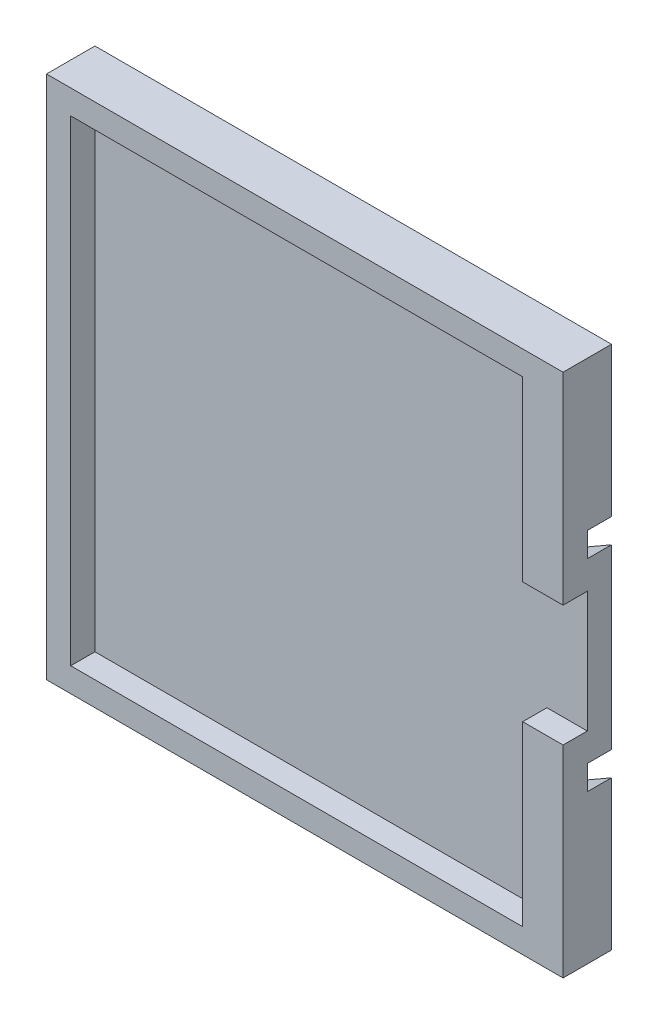
ISO-10303-21;
HEADER;
FILE_DESCRIPTION(('STEP AP214'),'2;1');
FILE_NAME('part.step','',(''),(''),'','','');
FILE_SCHEMA(('AUTOMOTIVE_DESIGN { 1 0 10303 214 1 1 1 1 }'));
ENDSEC;
DATA;
#1=APPLICATION_CONTEXT('core data for automotive mechanical design processes');
#2=APPLICATION_PROTOCOL_DEFINITION('international standard','automotive_design',2000,#1);
#3=PRODUCT_CONTEXT('',#1,'mechanical');
#4=PRODUCT('Part','Part','',(#3));
#5=PRODUCT_RELATED_PRODUCT_CATEGORY('part','',(#4));
#6=PRODUCT_DEFINITION_FORMATION('','',#4);
#7=PRODUCT_DEFINITION_CONTEXT('part definition',#1,'design');
#8=PRODUCT_DEFINITION('design','',#6,#7);
#9=PRODUCT_DEFINITION_SHAPE('','',#8);
#10=(LENGTH_UNIT() NAMED_UNIT(*) SI_UNIT(.MILLI.,.METRE.));
#11=(NAMED_UNIT(*) PLANE_ANGLE_UNIT() SI_UNIT($,.RADIAN.));
#12=(NAMED_UNIT(*) SI_UNIT($,.STERADIAN.) SOLID_ANGLE_UNIT());
#13=UNCERTAINTY_MEASURE_WITH_UNIT(LENGTH_MEASURE(1.E-05),#10,'distance_accuracy_value','');
#14=(GEOMETRIC_REPRESENTATION_CONTEXT(3) GLOBAL_UNCERTAINTY_ASSIGNED_CONTEXT((#13)) GLOBAL_UNIT_ASSIGNED_CONTEXT((#10,
#11,#12)) REPRESENTATION_CONTEXT('',''));
#15=CARTESIAN_POINT('',(0.,0.,0.));
#16=DIRECTION('',(0.,0.,1.));
#17=DIRECTION('',(1.,0.,0.));
#18=AXIS2_PLACEMENT_3D('',#15,#16,#17);
#19=CARTESIAN_POINT('',(6.48577771688617,-11.2336965322449,6.));
#20=DIRECTION('',(0.500000000000001,-0.866025403784438,0.));
#21=DIRECTION('',(0.866025403784438,0.500000000000001,0.));
#22=AXIS2_PLACEMENT_3D('',#19,#20,#21);
#23=PLANE('',#22);
#24=DIRECTION('',(-0.866025403784438,-0.5,0.));
#25=VECTOR('',#24,1.);
#26=CARTESIAN_POINT('',(6.48577771688617,-11.2336965322449,0.));
#27=LINE('',#26,#25);
#28=CARTESIAN_POINT('',(64.,21.9721551851429,0.));
#29=VERTEX_POINT('',#28);
#30=CARTESIAN_POINT('',(55.8729999999999,17.2800295474387,0.));
#31=VERTEX_POINT('',#30);
#32=EDGE_CURVE('E266',#29,#31,#27,.T.);
#33=ORIENTED_EDGE('',*,*,#32,.T.);
#34=DIRECTION('',(0.,0.,-1.));
#35=VECTOR('',#34,1.);
#36=CARTESIAN_POINT('',(55.8729999999999,17.2800295474387,6.));
#37=LINE('',#36,#35);
#38=CARTESIAN_POINT('',(55.8729999999999,17.2800295474387,6.));
#39=VERTEX_POINT('',#38);
#40=EDGE_CURVE('E11',#39,#31,#37,.T.);
#41=ORIENTED_EDGE('',*,*,#40,.F.);
#42=DIRECTION('',(-0.866025403784438,-0.5,0.));
#43=VECTOR('',#42,1.);
#44=CARTESIAN_POINT('',(6.48577771688617,-11.2336965322449,6.));
#45=LINE('',#44,#43);
#46=CARTESIAN_POINT('',(64.,21.9721551851429,6.));
#47=VERTEX_POINT('',#46);
#48=EDGE_CURVE('E267',#47,#39,#45,.T.);
#49=ORIENTED_EDGE('',*,*,#48,.F.);
#50=DIRECTION('',(0.,0.,-1.));
#51=VECTOR('',#50,1.);
#52=CARTESIAN_POINT('',(64.,21.9721551851429,6.));
#53=LINE('',#52,#51);
#54=EDGE_CURVE('E289',#47,#29,#53,.T.);
#55=ORIENTED_EDGE('',*,*,#54,.T.);
#56=EDGE_LOOP('',(#33,#41,#49,#55));
#57=FACE_BOUND('',#56,.T.);
#58=ADVANCED_FACE('F41',(#57),#23,.F.);
#59=CARTESIAN_POINT('',(55.8729999999999,0.,6.));
#60=DIRECTION('',(-1.,0.,0.));
#61=DIRECTION('',(0.,-1.,0.));
#62=AXIS2_PLACEMENT_3D('',#59,#60,#61);
#63=PLANE('',#62);
#64=DIRECTION('',(0.,1.,0.));
#65=VECTOR('',#64,1.);
#66=CARTESIAN_POINT('',(55.8729999999999,0.,0.));
#67=LINE('',#66,#65);
#68=CARTESIAN_POINT('',(55.8729999999999,32.7199704525613,0.));
#69=VERTEX_POINT('',#68);
#70=EDGE_CURVE('E292',#31,#69,#67,.T.);
#71=ORIENTED_EDGE('',*,*,#70,.T.);
#72=DIRECTION('',(0.,0.,-1.));
#73=VECTOR('',#72,1.);
#74=CARTESIAN_POINT('',(55.8729999999999,32.7199704525613,6.));
#75=LINE('',#74,#73);
#76=CARTESIAN_POINT('',(55.8729999999999,32.7199704525613,6.));
#77=VERTEX_POINT('',#76);
#78=EDGE_CURVE('E48',#77,#69,#75,.T.);
#79=ORIENTED_EDGE('',*,*,#78,.F.);
#80=DIRECTION('',(0.,1.,0.));
#81=VECTOR('',#80,1.);
#82=CARTESIAN_POINT('',(55.8729999999999,0.,6.));
#83=LINE('',#82,#81);
#84=EDGE_CURVE('E270',#39,#77,#83,.T.);
#85=ORIENTED_EDGE('',*,*,#84,.F.);
#86=ORIENTED_EDGE('',*,*,#40,.T.);
#87=EDGE_LOOP('',(#71,#79,#85,#86));
#88=FACE_BOUND('',#87,.T.);
#89=ADVANCED_FACE('F354',(#88),#63,.F.);
#90=CARTESIAN_POINT('',(28.1364128114971,48.7336965322449,6.));
#91=DIRECTION('',(0.5,0.866025403784439,0.));
#92=DIRECTION('',(-0.866025403784439,0.5,0.));
#93=AXIS2_PLACEMENT_3D('',#90,#91,#92);
#94=PLANE('',#93);
#95=DIRECTION('',(0.866025403784439,-0.5,0.));
#96=VECTOR('',#95,1.);
#97=CARTESIAN_POINT('',(28.1364128114971,48.7336965322449,0.));
#98=LINE('',#97,#96);
#99=CARTESIAN_POINT('',(64.,28.0278448148571,0.));
#100=VERTEX_POINT('',#99);
#101=EDGE_CURVE('E294',#69,#100,#98,.T.);
#102=ORIENTED_EDGE('',*,*,#101,.T.);
#103=DIRECTION('',(0.,0.,-1.));
#104=VECTOR('',#103,1.);
#105=CARTESIAN_POINT('',(64.,28.0278448148571,6.));
#106=LINE('',#105,#104);
#107=CARTESIAN_POINT('',(64.,28.0278448148571,6.));
#108=VERTEX_POINT('',#107);
#109=EDGE_CURVE('E332',#108,#100,#106,.T.);
#110=ORIENTED_EDGE('',*,*,#109,.F.);
#111=DIRECTION('',(0.866025403784439,-0.5,0.));
#112=VECTOR('',#111,1.);
#113=CARTESIAN_POINT('',(28.1364128114971,48.7336965322449,6.));
#114=LINE('',#113,#112);
#115=EDGE_CURVE('E274',#77,#108,#114,.T.);
#116=ORIENTED_EDGE('',*,*,#115,.F.);
#117=ORIENTED_EDGE('',*,*,#78,.T.);
#118=EDGE_LOOP('',(#102,#110,#116,#117));
#119=FACE_BOUND('',#118,.T.);
#120=ADVANCED_FACE('F338',(#119),#94,.F.);
#121=CARTESIAN_POINT('',(0.,65.,6.));
#122=DIRECTION('',(0.,1.,0.));
#123=DIRECTION('',(-1.,0.,0.));
#124=AXIS2_PLACEMENT_3D('',#121,#122,#123);
#125=PLANE('',#124);
#126=DIRECTION('',(1.,0.,0.));
#127=VECTOR('',#126,1.);
#128=CARTESIAN_POINT('',(0.,65.,0.));
#129=LINE('',#128,#127);
#130=CARTESIAN_POINT('',(-64.,65.,0.));
#131=VERTEX_POINT('',#130);
#132=CARTESIAN_POINT('',(64.,65.,0.));
#133=VERTEX_POINT('',#132);
#134=EDGE_CURVE('E299',#131,#133,#129,.T.);
#135=ORIENTED_EDGE('',*,*,#134,.F.);
#136=DIRECTION('',(0.,0.,-1.));
#137=VECTOR('',#136,1.);
#138=CARTESIAN_POINT('',(-64.,65.,6.));
#139=LINE('',#138,#137);
#140=CARTESIAN_POINT('',(-64.,65.,12.));
#141=VERTEX_POINT('',#140);
#142=EDGE_CURVE('E184',#141,#131,#139,.T.);
#143=ORIENTED_EDGE('',*,*,#142,.F.);
#144=DIRECTION('',(-1.,0.,0.));
#145=VECTOR('',#144,1.);
#146=CARTESIAN_POINT('',(-64.,65.,12.));
#147=LINE('',#146,#145);
#148=CARTESIAN_POINT('',(64.,65.,12.));
#149=VERTEX_POINT('',#148);
#150=EDGE_CURVE('E199',#149,#141,#147,.T.);
#151=ORIENTED_EDGE('',*,*,#150,.F.);
#152=DIRECTION('',(0.,0.,-1.));
#153=VECTOR('',#152,1.);
#154=CARTESIAN_POINT('',(64.,65.,6.));
#155=LINE('',#154,#153);
#156=EDGE_CURVE('E330',#149,#133,#155,.T.);
#157=ORIENTED_EDGE('',*,*,#156,.T.);
#158=EDGE_LOOP('',(#135,#143,#151,#157));
#159=FACE_BOUND('',#158,.T.);
#160=ADVANCED_FACE('F417',(#159),#125,.T.);
#161=CARTESIAN_POINT('',(-64.,0.,6.));
#162=DIRECTION('',(-1.,0.,0.));
#163=DIRECTION('',(0.,0.,1.));
#164=AXIS2_PLACEMENT_3D('',#161,#162,#163);
#165=PLANE('',#164);
#166=DIRECTION('',(0.,1.,0.));
#167=VECTOR('',#166,1.);
#168=CARTESIAN_POINT('',(-64.,0.,0.));
#169=LINE('',#168,#167);
#170=CARTESIAN_POINT('',(-64.,-65.,0.));
#171=VERTEX_POINT('',#170);
#172=EDGE_CURVE('E181',#171,#131,#169,.T.);
#173=ORIENTED_EDGE('',*,*,#172,.F.);
#174=DIRECTION('',(0.,0.,-1.));
#175=VECTOR('',#174,1.);
#176=CARTESIAN_POINT('',(-64.,-65.,6.));
#177=LINE('',#176,#175);
#178=CARTESIAN_POINT('',(-64.,-65.,12.));
#179=VERTEX_POINT('',#178);
#180=EDGE_CURVE('E175',#179,#171,#177,.T.);
#181=ORIENTED_EDGE('',*,*,#180,.F.);
#182=DIRECTION('',(0.,-1.,0.));
#183=VECTOR('',#182,1.);
#184=CARTESIAN_POINT('',(-64.,65.,12.));
#185=LINE('',#184,#183);
#186=EDGE_CURVE('E179',#141,#179,#185,.T.);
#187=ORIENTED_EDGE('',*,*,#186,.F.);
#188=ORIENTED_EDGE('',*,*,#142,.T.);
#189=EDGE_LOOP('',(#173,#181,#187,#188));
#190=FACE_BOUND('',#189,.T.);
#191=ADVANCED_FACE('F177',(#190),#165,.T.);
#192=CARTESIAN_POINT('',(0.,-65.,6.));
#193=DIRECTION('',(0.,1.,0.));
#194=DIRECTION('',(0.,0.,1.));
#195=AXIS2_PLACEMENT_3D('',#192,#193,#194);
#196=PLANE('',#195);
#197=DIRECTION('',(1.,0.,0.));
#198=VECTOR('',#197,1.);
#199=CARTESIAN_POINT('',(0.,-65.,0.));
#200=LINE('',#199,#198);
#201=CARTESIAN_POINT('',(64.,-65.,0.));
#202=VERTEX_POINT('',#201);
#203=EDGE_CURVE('E303',#171,#202,#200,.T.);
#204=ORIENTED_EDGE('',*,*,#203,.T.);
#205=DIRECTION('',(0.,0.,-1.));
#206=VECTOR('',#205,1.);
#207=CARTESIAN_POINT('',(64.,-65.,6.));
#208=LINE('',#207,#206);
#209=CARTESIAN_POINT('',(64.,-65.,12.));
#210=VERTEX_POINT('',#209);
#211=EDGE_CURVE('E185',#210,#202,#208,.T.);
#212=ORIENTED_EDGE('',*,*,#211,.F.);
#213=DIRECTION('',(1.,0.,0.));
#214=VECTOR('',#213,1.);
#215=CARTESIAN_POINT('',(-64.,-65.,12.));
#216=LINE('',#215,#214);
#217=EDGE_CURVE('E188',#179,#210,#216,.T.);
#218=ORIENTED_EDGE('',*,*,#217,.F.);
#219=ORIENTED_EDGE('',*,*,#180,.T.);
#220=EDGE_LOOP('',(#204,#212,#218,#219));
#221=FACE_BOUND('',#220,.T.);
#222=ADVANCED_FACE('F189',(#221),#196,.F.);
#223=CARTESIAN_POINT('',(28.136412811497,-48.7336965322449,6.));
#224=DIRECTION('',(-0.499999999999999,0.866025403784439,0.));
#225=DIRECTION('',(-0.866025403784439,-0.499999999999999,0.));
#226=AXIS2_PLACEMENT_3D('',#223,#224,#225);
#227=PLANE('',#226);
#228=DIRECTION('',(0.866025403784439,0.499999999999999,0.));
#229=VECTOR('',#228,1.);
#230=CARTESIAN_POINT('',(28.136412811497,-48.7336965322449,0.));
#231=LINE('',#230,#229);
#232=CARTESIAN_POINT('',(55.8729999999999,-32.7199704525612,0.));
#233=VERTEX_POINT('',#232);
#234=CARTESIAN_POINT('',(64.,-28.0278448148571,0.));
#235=VERTEX_POINT('',#234);
#236=EDGE_CURVE('E308',#233,#235,#231,.T.);
#237=ORIENTED_EDGE('',*,*,#236,.F.);
#238=DIRECTION('',(0.,0.,-1.));
#239=VECTOR('',#238,1.);
#240=CARTESIAN_POINT('',(55.8729999999999,-32.7199704525612,6.));
#241=LINE('',#240,#239);
#242=CARTESIAN_POINT('',(55.8729999999999,-32.7199704525612,6.));
#243=VERTEX_POINT('',#242);
#244=EDGE_CURVE('E324',#243,#233,#241,.T.);
#245=ORIENTED_EDGE('',*,*,#244,.F.);
#246=DIRECTION('',(0.866025403784439,0.499999999999999,0.));
#247=VECTOR('',#246,1.);
#248=CARTESIAN_POINT('',(28.136412811497,-48.7336965322449,6.));
#249=LINE('',#248,#247);
#250=CARTESIAN_POINT('',(64.,-28.0278448148571,6.));
#251=VERTEX_POINT('',#250);
#252=EDGE_CURVE('E277',#243,#251,#249,.T.);
#253=ORIENTED_EDGE('',*,*,#252,.T.);
#254=DIRECTION('',(0.,0.,-1.));
#255=VECTOR('',#254,1.);
#256=CARTESIAN_POINT('',(64.,-28.0278448148571,6.));
#257=LINE('',#256,#255);
#258=EDGE_CURVE('E326',#251,#235,#257,.T.);
#259=ORIENTED_EDGE('',*,*,#258,.T.);
#260=EDGE_LOOP('',(#237,#245,#253,#259));
#261=FACE_BOUND('',#260,.T.);
#262=ADVANCED_FACE('F369',(#261),#227,.T.);
#263=CARTESIAN_POINT('',(55.8729999999999,0.,6.));
#264=DIRECTION('',(1.,0.,0.));
#265=DIRECTION('',(0.,0.,-1.));
#266=AXIS2_PLACEMENT_3D('',#263,#264,#265);
#267=PLANE('',#266);
#268=DIRECTION('',(0.,-1.,0.));
#269=VECTOR('',#268,1.);
#270=CARTESIAN_POINT('',(55.8729999999999,0.,0.));
#271=LINE('',#270,#269);
#272=CARTESIAN_POINT('',(55.8729999999999,-17.2800295474388,0.));
#273=VERTEX_POINT('',#272);
#274=EDGE_CURVE('E311',#273,#233,#271,.T.);
#275=ORIENTED_EDGE('',*,*,#274,.F.);
#276=DIRECTION('',(0.,0.,-1.));
#277=VECTOR('',#276,1.);
#278=CARTESIAN_POINT('',(55.8729999999999,-17.2800295474388,6.));
#279=LINE('',#278,#277);
#280=CARTESIAN_POINT('',(55.8729999999999,-17.2800295474388,6.));
#281=VERTEX_POINT('',#280);
#282=EDGE_CURVE('E322',#281,#273,#279,.T.);
#283=ORIENTED_EDGE('',*,*,#282,.F.);
#284=DIRECTION('',(0.,-1.,0.));
#285=VECTOR('',#284,1.);
#286=CARTESIAN_POINT('',(55.8729999999999,0.,6.));
#287=LINE('',#286,#285);
#288=EDGE_CURVE('E280',#281,#243,#287,.T.);
#289=ORIENTED_EDGE('',*,*,#288,.T.);
#290=ORIENTED_EDGE('',*,*,#244,.T.);
#291=EDGE_LOOP('',(#275,#283,#289,#290));
#292=FACE_BOUND('',#291,.T.);
#293=ADVANCED_FACE('F365',(#292),#267,.T.);
#294=CARTESIAN_POINT('',(6.48577771688608,11.2336965322448,6.));
#295=DIRECTION('',(-0.499999999999999,-0.866025403784439,0.));
#296=DIRECTION('',(0.866025403784439,-0.499999999999999,0.));
#297=AXIS2_PLACEMENT_3D('',#294,#295,#296);
#298=PLANE('',#297);
#299=DIRECTION('',(-0.86602540378444,0.499999999999999,0.));
#300=VECTOR('',#299,1.);
#301=CARTESIAN_POINT('',(6.48577771688608,11.2336965322448,0.));
#302=LINE('',#301,#300);
#303=CARTESIAN_POINT('',(64.,-21.9721551851429,0.));
#304=VERTEX_POINT('',#303);
#305=EDGE_CURVE('E314',#304,#273,#302,.T.);
#306=ORIENTED_EDGE('',*,*,#305,.F.);
#307=DIRECTION('',(0.,0.,-1.));
#308=VECTOR('',#307,1.);
#309=CARTESIAN_POINT('',(64.,-21.9721551851429,6.));
#310=LINE('',#309,#308);
#311=CARTESIAN_POINT('',(64.,-21.9721551851429,6.));
#312=VERTEX_POINT('',#311);
#313=EDGE_CURVE('E320',#312,#304,#310,.T.);
#314=ORIENTED_EDGE('',*,*,#313,.F.);
#315=DIRECTION('',(-0.86602540378444,0.499999999999999,0.));
#316=VECTOR('',#315,1.);
#317=CARTESIAN_POINT('',(6.48577771688608,11.2336965322448,6.));
#318=LINE('',#317,#316);
#319=EDGE_CURVE('E283',#312,#281,#318,.T.);
#320=ORIENTED_EDGE('',*,*,#319,.T.);
#321=ORIENTED_EDGE('',*,*,#282,.T.);
#322=EDGE_LOOP('',(#306,#314,#320,#321));
#323=FACE_BOUND('',#322,.T.);
#324=ADVANCED_FACE('F360',(#323),#298,.T.);
#325=CARTESIAN_POINT('',(64.,0.,6.));
#326=DIRECTION('',(1.,0.,0.));
#327=DIRECTION('',(0.,0.,-1.));
#328=AXIS2_PLACEMENT_3D('',#325,#326,#327);
#329=PLANE('',#328);
#330=DIRECTION('',(0.,-1.,0.));
#331=VECTOR('',#330,1.);
#332=CARTESIAN_POINT('',(64.,0.,0.));
#333=LINE('',#332,#331);
#334=EDGE_CURVE('E271',#29,#304,#333,.T.);
#335=ORIENTED_EDGE('',*,*,#334,.F.);
#336=ORIENTED_EDGE('',*,*,#54,.F.);
#337=DIRECTION('',(0.,1.,0.));
#338=VECTOR('',#337,1.);
#339=CARTESIAN_POINT('',(64.,65.,6.));
#340=LINE('',#339,#338);
#341=EDGE_CURVE('E200',#47,#108,#340,.T.);
#342=ORIENTED_EDGE('',*,*,#341,.T.);
#343=ORIENTED_EDGE('',*,*,#109,.T.);
#344=DIRECTION('',(0.,1.,0.));
#345=VECTOR('',#344,1.);
#346=CARTESIAN_POINT('',(64.,0.,0.));
#347=LINE('',#346,#345);
#348=EDGE_CURVE('E296',#100,#133,#347,.T.);
#349=ORIENTED_EDGE('',*,*,#348,.T.);
#350=ORIENTED_EDGE('',*,*,#156,.F.);
#351=DIRECTION('',(0.,1.,0.));
#352=VECTOR('',#351,1.);
#353=CARTESIAN_POINT('',(64.,65.,12.));
#354=LINE('',#353,#352);
#355=CARTESIAN_POINT('',(64.,15.,12.));
#356=VERTEX_POINT('',#355);
#357=EDGE_CURVE('E220',#356,#149,#354,.T.);
#358=ORIENTED_EDGE('',*,*,#357,.F.);
#359=DIRECTION('',(0.,0.,-1.));
#360=VECTOR('',#359,1.);
#361=CARTESIAN_POINT('',(64.,15.,12.));
#362=LINE('',#361,#360);
#363=CARTESIAN_POINT('',(64.,15.,6.));
#364=VERTEX_POINT('',#363);
#365=EDGE_CURVE('E223',#356,#364,#362,.T.);
#366=ORIENTED_EDGE('',*,*,#365,.T.);
#367=DIRECTION('',(0.,-1.,0.));
#368=VECTOR('',#367,1.);
#369=CARTESIAN_POINT('',(64.,0.,6.));
#370=LINE('',#369,#368);
#371=CARTESIAN_POINT('',(64.,-15.,6.));
#372=VERTEX_POINT('',#371);
#373=EDGE_CURVE('E286',#364,#372,#370,.T.);
#374=ORIENTED_EDGE('',*,*,#373,.T.);
#375=DIRECTION('',(0.,0.,-1.));
#376=VECTOR('',#375,1.);
#377=CARTESIAN_POINT('',(63.9999999999999,-15.,12.));
#378=LINE('',#377,#376);
#379=CARTESIAN_POINT('',(63.9999999999999,-15.,12.));
#380=VERTEX_POINT('',#379);
#381=EDGE_CURVE('E263',#380,#372,#378,.T.);
#382=ORIENTED_EDGE('',*,*,#381,.F.);
#383=DIRECTION('',(0.,1.,0.));
#384=VECTOR('',#383,1.);
#385=CARTESIAN_POINT('',(63.9999999999999,-15.,12.));
#386=LINE('',#385,#384);
#387=EDGE_CURVE('E193',#210,#380,#386,.T.);
#388=ORIENTED_EDGE('',*,*,#387,.F.);
#389=ORIENTED_EDGE('',*,*,#211,.T.);
#390=DIRECTION('',(0.,1.,0.));
#391=VECTOR('',#390,1.);
#392=CARTESIAN_POINT('',(64.,0.,0.));
#393=LINE('',#392,#391);
#394=EDGE_CURVE('E305',#202,#235,#393,.T.);
#395=ORIENTED_EDGE('',*,*,#394,.T.);
#396=ORIENTED_EDGE('',*,*,#258,.F.);
#397=DIRECTION('',(0.,1.,0.));
#398=VECTOR('',#397,1.);
#399=CARTESIAN_POINT('',(63.9999999999999,-15.,6.));
#400=LINE('',#399,#398);
#401=EDGE_CURVE('E224',#251,#312,#400,.T.);
#402=ORIENTED_EDGE('',*,*,#401,.T.);
#403=ORIENTED_EDGE('',*,*,#313,.T.);
#404=EDGE_LOOP('',(#335,#336,#342,#343,#349,#350,#358,#366,#374,#382,#388,#389,#395,#396,#402,#403));
#405=FACE_BOUND('',#404,.T.);
#406=ADVANCED_FACE('F347',(#405),#329,.T.);
#407=CARTESIAN_POINT('',(0.,0.,6.));
#408=DIRECTION('',(0.,0.,1.));
#409=DIRECTION('',(1.,0.,0.));
#410=AXIS2_PLACEMENT_3D('',#407,#408,#409);
#411=PLANE('',#410);
#412=DIRECTION('',(1.,0.,0.));
#413=VECTOR('',#412,1.);
#414=CARTESIAN_POINT('',(54.,15.,6.));
#415=LINE('',#414,#413);
#416=CARTESIAN_POINT('',(54.,15.,6.));
#417=VERTEX_POINT('',#416);
#418=EDGE_CURVE('E55',#417,#364,#415,.T.);
#419=ORIENTED_EDGE('',*,*,#418,.F.);
#420=DIRECTION('',(0.,-1.,0.));
#421=VECTOR('',#420,1.);
#422=CARTESIAN_POINT('',(54.,59.,6.));
#423=LINE('',#422,#421);
#424=CARTESIAN_POINT('',(54.,59.,6.));
#425=VERTEX_POINT('',#424);
#426=EDGE_CURVE('E59',#425,#417,#423,.T.);
#427=ORIENTED_EDGE('',*,*,#426,.F.);
#428=DIRECTION('',(1.,0.,0.));
#429=VECTOR('',#428,1.);
#430=CARTESIAN_POINT('',(-58.,59.,6.));
#431=LINE('',#430,#429);
#432=CARTESIAN_POINT('',(-58.,59.,6.));
#433=VERTEX_POINT('',#432);
#434=EDGE_CURVE('E239',#433,#425,#431,.T.);
#435=ORIENTED_EDGE('',*,*,#434,.F.);
#436=DIRECTION('',(0.,1.,0.));
#437=VECTOR('',#436,1.);
#438=CARTESIAN_POINT('',(-58.,59.,6.));
#439=LINE('',#438,#437);
#440=CARTESIAN_POINT('',(-58.,-59.,6.));
#441=VERTEX_POINT('',#440);
#442=EDGE_CURVE('E236',#441,#433,#439,.T.);
#443=ORIENTED_EDGE('',*,*,#442,.F.);
#444=DIRECTION('',(-1.,0.,0.));
#445=VECTOR('',#444,1.);
#446=CARTESIAN_POINT('',(-58.,-59.,6.));
#447=LINE('',#446,#445);
#448=CARTESIAN_POINT('',(53.9999999999999,-59.,6.));
#449=VERTEX_POINT('',#448);
#450=EDGE_CURVE('E233',#449,#441,#447,.T.);
#451=ORIENTED_EDGE('',*,*,#450,.F.);
#452=DIRECTION('',(0.,-1.,0.));
#453=VECTOR('',#452,1.);
#454=CARTESIAN_POINT('',(53.9999999999999,-15.,6.));
#455=LINE('',#454,#453);
#456=CARTESIAN_POINT('',(53.9999999999999,-15.,6.));
#457=VERTEX_POINT('',#456);
#458=EDGE_CURVE('E230',#457,#449,#455,.T.);
#459=ORIENTED_EDGE('',*,*,#458,.F.);
#460=DIRECTION('',(-1.,0.,0.));
#461=VECTOR('',#460,1.);
#462=CARTESIAN_POINT('',(53.9999999999999,-15.,6.));
#463=LINE('',#462,#461);
#464=EDGE_CURVE('E227',#372,#457,#463,.T.);
#465=ORIENTED_EDGE('',*,*,#464,.F.);
#466=ORIENTED_EDGE('',*,*,#373,.F.);
#467=EDGE_LOOP('',(#419,#427,#435,#443,#451,#459,#465,#466));
#468=FACE_BOUND('',#467,.T.);
#469=ADVANCED_FACE('F399',(#468),#411,.T.);
#470=CARTESIAN_POINT('',(0.,0.,0.));
#471=DIRECTION('',(0.,0.,1.));
#472=DIRECTION('',(1.,0.,0.));
#473=AXIS2_PLACEMENT_3D('',#470,#471,#472);
#474=PLANE('',#473);
#475=ORIENTED_EDGE('',*,*,#32,.F.);
#476=ORIENTED_EDGE('',*,*,#334,.T.);
#477=ORIENTED_EDGE('',*,*,#305,.T.);
#478=ORIENTED_EDGE('',*,*,#274,.T.);
#479=ORIENTED_EDGE('',*,*,#236,.T.);
#480=ORIENTED_EDGE('',*,*,#394,.F.);
#481=ORIENTED_EDGE('',*,*,#203,.F.);
#482=ORIENTED_EDGE('',*,*,#172,.T.);
#483=ORIENTED_EDGE('',*,*,#134,.T.);
#484=ORIENTED_EDGE('',*,*,#348,.F.);
#485=ORIENTED_EDGE('',*,*,#101,.F.);
#486=ORIENTED_EDGE('',*,*,#70,.F.);
#487=EDGE_LOOP('',(#475,#476,#477,#478,#479,#480,#481,#482,#483,#484,#485,#486));
#488=FACE_BOUND('',#487,.T.);
#489=ADVANCED_FACE('F343',(#488),#474,.F.);
#490=CARTESIAN_POINT('',(0.,0.,6.));
#491=DIRECTION('',(0.,0.,1.));
#492=DIRECTION('',(1.,0.,0.));
#493=AXIS2_PLACEMENT_3D('',#490,#491,#492);
#494=PLANE('',#493);
#495=ORIENTED_EDGE('',*,*,#341,.F.);
#496=ORIENTED_EDGE('',*,*,#48,.T.);
#497=ORIENTED_EDGE('',*,*,#84,.T.);
#498=ORIENTED_EDGE('',*,*,#115,.T.);
#499=EDGE_LOOP('',(#495,#496,#497,#498));
#500=FACE_BOUND('',#499,.T.);
#501=ADVANCED_FACE('F351',(#500),#494,.F.);
#502=CARTESIAN_POINT('',(53.9999999999999,-15.,12.));
#503=DIRECTION('',(0.,-1.,0.));
#504=DIRECTION('',(0.,0.,-1.));
#505=AXIS2_PLACEMENT_3D('',#502,#503,#504);
#506=PLANE('',#505);
#507=ORIENTED_EDGE('',*,*,#464,.T.);
#508=DIRECTION('',(0.,0.,-1.));
#509=VECTOR('',#508,1.);
#510=CARTESIAN_POINT('',(53.9999999999999,-15.,12.));
#511=LINE('',#510,#509);
#512=CARTESIAN_POINT('',(53.9999999999999,-15.,12.));
#513=VERTEX_POINT('',#512);
#514=EDGE_CURVE('E260',#513,#457,#511,.T.);
#515=ORIENTED_EDGE('',*,*,#514,.F.);
#516=DIRECTION('',(-1.,0.,0.));
#517=VECTOR('',#516,1.);
#518=CARTESIAN_POINT('',(53.9999999999999,-15.,12.));
#519=LINE('',#518,#517);
#520=EDGE_CURVE('E206',#380,#513,#519,.T.);
#521=ORIENTED_EDGE('',*,*,#520,.F.);
#522=ORIENTED_EDGE('',*,*,#381,.T.);
#523=EDGE_LOOP('',(#507,#515,#521,#522));
#524=FACE_BOUND('',#523,.T.);
#525=ADVANCED_FACE('F376',(#524),#506,.F.);
#526=CARTESIAN_POINT('',(53.9999999999999,-15.,12.));
#527=DIRECTION('',(1.,0.,0.));
#528=DIRECTION('',(0.,0.,-1.));
#529=AXIS2_PLACEMENT_3D('',#526,#527,#528);
#530=PLANE('',#529);
#531=ORIENTED_EDGE('',*,*,#458,.T.);
#532=DIRECTION('',(0.,0.,-1.));
#533=VECTOR('',#532,1.);
#534=CARTESIAN_POINT('',(53.9999999999999,-59.,12.));
#535=LINE('',#534,#533);
#536=CARTESIAN_POINT('',(53.9999999999999,-59.,12.));
#537=VERTEX_POINT('',#536);
#538=EDGE_CURVE('E257',#537,#449,#535,.T.);
#539=ORIENTED_EDGE('',*,*,#538,.F.);
#540=DIRECTION('',(0.,-1.,0.));
#541=VECTOR('',#540,1.);
#542=CARTESIAN_POINT('',(53.9999999999999,-15.,12.));
#543=LINE('',#542,#541);
#544=EDGE_CURVE('E208',#513,#537,#543,.T.);
#545=ORIENTED_EDGE('',*,*,#544,.F.);
#546=ORIENTED_EDGE('',*,*,#514,.T.);
#547=EDGE_LOOP('',(#531,#539,#545,#546));
#548=FACE_BOUND('',#547,.T.);
#549=ADVANCED_FACE('F378',(#548),#530,.F.);
#550=CARTESIAN_POINT('',(-58.,-59.,12.));
#551=DIRECTION('',(0.,-1.,0.));
#552=DIRECTION('',(1.,0.,0.));
#553=AXIS2_PLACEMENT_3D('',#550,#551,#552);
#554=PLANE('',#553);
#555=ORIENTED_EDGE('',*,*,#450,.T.);
#556=DIRECTION('',(0.,0.,-1.));
#557=VECTOR('',#556,1.);
#558=CARTESIAN_POINT('',(-58.,-59.,12.));
#559=LINE('',#558,#557);
#560=CARTESIAN_POINT('',(-58.,-59.,12.));
#561=VERTEX_POINT('',#560);
#562=EDGE_CURVE('E254',#561,#441,#559,.T.);
#563=ORIENTED_EDGE('',*,*,#562,.F.);
#564=DIRECTION('',(-1.,0.,0.));
#565=VECTOR('',#564,1.);
#566=CARTESIAN_POINT('',(-58.,-59.,12.));
#567=LINE('',#566,#565);
#568=EDGE_CURVE('E210',#537,#561,#567,.T.);
#569=ORIENTED_EDGE('',*,*,#568,.F.);
#570=ORIENTED_EDGE('',*,*,#538,.T.);
#571=EDGE_LOOP('',(#555,#563,#569,#570));
#572=FACE_BOUND('',#571,.T.);
#573=ADVANCED_FACE('F382',(#572),#554,.F.);
#574=CARTESIAN_POINT('',(-58.,59.,12.));
#575=DIRECTION('',(-1.,0.,0.));
#576=DIRECTION('',(0.,0.,1.));
#577=AXIS2_PLACEMENT_3D('',#574,#575,#576);
#578=PLANE('',#577);
#579=ORIENTED_EDGE('',*,*,#442,.T.);
#580=DIRECTION('',(0.,0.,-1.));
#581=VECTOR('',#580,1.);
#582=CARTESIAN_POINT('',(-58.,59.,12.));
#583=LINE('',#582,#581);
#584=CARTESIAN_POINT('',(-58.,59.,12.));
#585=VERTEX_POINT('',#584);
#586=EDGE_CURVE('E251',#585,#433,#583,.T.);
#587=ORIENTED_EDGE('',*,*,#586,.F.);
#588=DIRECTION('',(0.,1.,0.));
#589=VECTOR('',#588,1.);
#590=CARTESIAN_POINT('',(-58.,59.,12.));
#591=LINE('',#590,#589);
#592=EDGE_CURVE('E212',#561,#585,#591,.T.);
#593=ORIENTED_EDGE('',*,*,#592,.F.);
#594=ORIENTED_EDGE('',*,*,#562,.T.);
#595=EDGE_LOOP('',(#579,#587,#593,#594));
#596=FACE_BOUND('',#595,.T.);
#597=ADVANCED_FACE('F388',(#596),#578,.F.);
#598=CARTESIAN_POINT('',(-58.,59.,12.));
#599=DIRECTION('',(0.,1.,0.));
#600=DIRECTION('',(0.,0.,1.));
#601=AXIS2_PLACEMENT_3D('',#598,#599,#600);
#602=PLANE('',#601);
#603=ORIENTED_EDGE('',*,*,#434,.T.);
#604=DIRECTION('',(0.,0.,-1.));
#605=VECTOR('',#604,1.);
#606=CARTESIAN_POINT('',(54.,59.,12.));
#607=LINE('',#606,#605);
#608=CARTESIAN_POINT('',(54.,59.,12.));
#609=VERTEX_POINT('',#608);
#610=EDGE_CURVE('E248',#609,#425,#607,.T.);
#611=ORIENTED_EDGE('',*,*,#610,.F.);
#612=DIRECTION('',(1.,0.,0.));
#613=VECTOR('',#612,1.);
#614=CARTESIAN_POINT('',(-58.,59.,12.));
#615=LINE('',#614,#613);
#616=EDGE_CURVE('E214',#585,#609,#615,.T.);
#617=ORIENTED_EDGE('',*,*,#616,.F.);
#618=ORIENTED_EDGE('',*,*,#586,.T.);
#619=EDGE_LOOP('',(#603,#611,#617,#618));
#620=FACE_BOUND('',#619,.T.);
#621=ADVANCED_FACE('F390',(#620),#602,.F.);
#622=CARTESIAN_POINT('',(54.,59.,12.));
#623=DIRECTION('',(1.,0.,0.));
#624=DIRECTION('',(0.,1.,0.));
#625=AXIS2_PLACEMENT_3D('',#622,#623,#624);
#626=PLANE('',#625);
#627=ORIENTED_EDGE('',*,*,#426,.T.);
#628=DIRECTION('',(0.,0.,-1.));
#629=VECTOR('',#628,1.);
#630=CARTESIAN_POINT('',(54.,15.,12.));
#631=LINE('',#630,#629);
#632=CARTESIAN_POINT('',(54.,15.,12.));
#633=VERTEX_POINT('',#632);
#634=EDGE_CURVE('E245',#633,#417,#631,.T.);
#635=ORIENTED_EDGE('',*,*,#634,.F.);
#636=DIRECTION('',(0.,-1.,0.));
#637=VECTOR('',#636,1.);
#638=CARTESIAN_POINT('',(54.,59.,12.));
#639=LINE('',#638,#637);
#640=EDGE_CURVE('E216',#609,#633,#639,.T.);
#641=ORIENTED_EDGE('',*,*,#640,.F.);
#642=ORIENTED_EDGE('',*,*,#610,.T.);
#643=EDGE_LOOP('',(#627,#635,#641,#642));
#644=FACE_BOUND('',#643,.T.);
#645=ADVANCED_FACE('F394',(#644),#626,.F.);
#646=CARTESIAN_POINT('',(54.,15.,12.));
#647=DIRECTION('',(0.,1.,0.));
#648=DIRECTION('',(0.,0.,1.));
#649=AXIS2_PLACEMENT_3D('',#646,#647,#648);
#650=PLANE('',#649);
#651=ORIENTED_EDGE('',*,*,#418,.T.);
#652=ORIENTED_EDGE('',*,*,#365,.F.);
#653=DIRECTION('',(1.,0.,0.));
#654=VECTOR('',#653,1.);
#655=CARTESIAN_POINT('',(54.,15.,12.));
#656=LINE('',#655,#654);
#657=EDGE_CURVE('E218',#633,#356,#656,.T.);
#658=ORIENTED_EDGE('',*,*,#657,.F.);
#659=ORIENTED_EDGE('',*,*,#634,.T.);
#660=EDGE_LOOP('',(#651,#652,#658,#659));
#661=FACE_BOUND('',#660,.T.);
#662=ADVANCED_FACE('F398',(#661),#650,.F.);
#663=CARTESIAN_POINT('',(0.,0.,12.));
#664=DIRECTION('',(0.,0.,1.));
#665=DIRECTION('',(1.,0.,0.));
#666=AXIS2_PLACEMENT_3D('',#663,#664,#665);
#667=PLANE('',#666);
#668=ORIENTED_EDGE('',*,*,#186,.T.);
#669=ORIENTED_EDGE('',*,*,#217,.T.);
#670=ORIENTED_EDGE('',*,*,#387,.T.);
#671=ORIENTED_EDGE('',*,*,#520,.T.);
#672=ORIENTED_EDGE('',*,*,#544,.T.);
#673=ORIENTED_EDGE('',*,*,#568,.T.);
#674=ORIENTED_EDGE('',*,*,#592,.T.);
#675=ORIENTED_EDGE('',*,*,#616,.T.);
#676=ORIENTED_EDGE('',*,*,#640,.T.);
#677=ORIENTED_EDGE('',*,*,#657,.T.);
#678=ORIENTED_EDGE('',*,*,#357,.T.);
#679=ORIENTED_EDGE('',*,*,#150,.T.);
#680=EDGE_LOOP('',(#668,#669,#670,#671,#672,#673,#674,#675,#676,#677,#678,#679));
#681=FACE_BOUND('',#680,.T.);
#682=ADVANCED_FACE('F196',(#681),#667,.T.);
#683=ORIENTED_EDGE('',*,*,#252,.F.);
#684=ORIENTED_EDGE('',*,*,#288,.F.);
#685=ORIENTED_EDGE('',*,*,#319,.F.);
#686=ORIENTED_EDGE('',*,*,#401,.F.);
#687=EDGE_LOOP('',(#683,#684,#685,#686));
#688=FACE_BOUND('',#687,.T.);
#689=ADVANCED_FACE('F455',(#688),#494,.F.);
#690=CLOSED_SHELL('',(#58,#89,#120,#160,#191,#222,#262,#293,#324,#406,#469,#489,#501,#525,#549,
#573,#597,#621,#645,#662,#682,#689));
#691=MANIFOLD_SOLID_BREP('B2',#690);
#692=ADVANCED_BREP_SHAPE_REPRESENTATION('',(#18,#691),#14);
#693=SHAPE_DEFINITION_REPRESENTATION(#9,#692);
ENDSEC;
END-ISO-10303-21;
